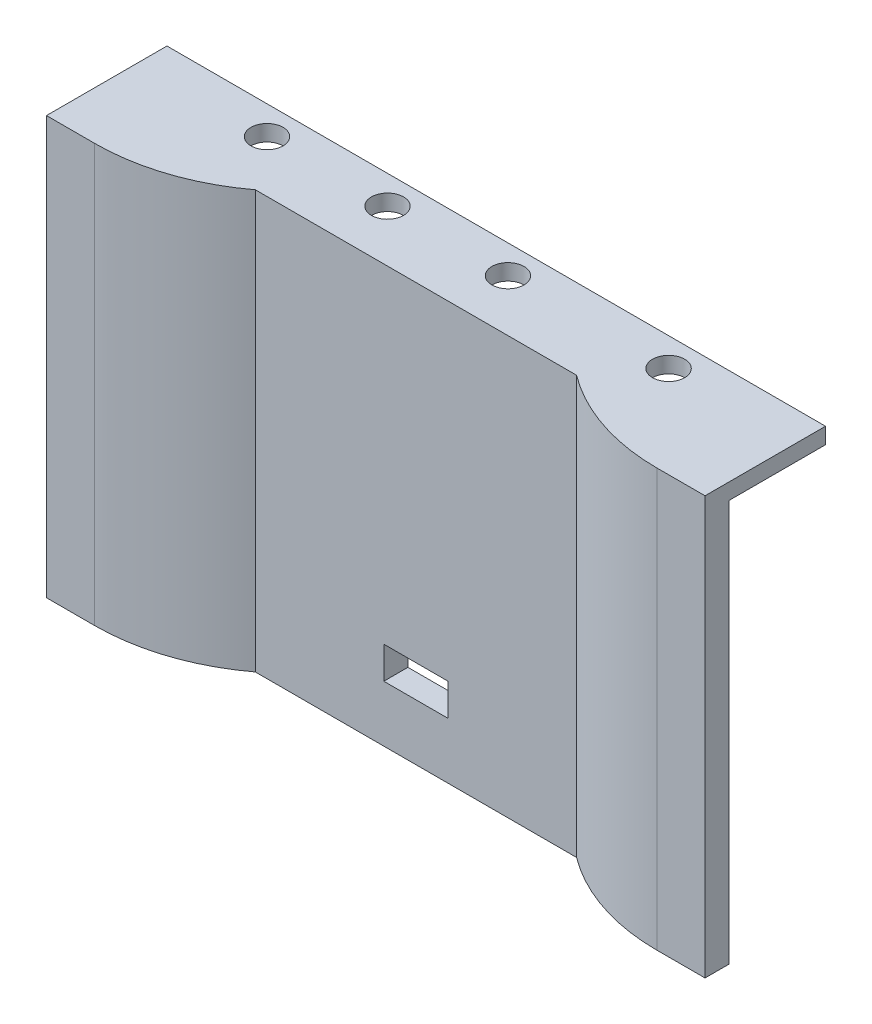
ISO-10303-21;
HEADER;
FILE_DESCRIPTION(('STEP AP214'),'2;1');
FILE_NAME('part.step','',(''),(''),'','','');
FILE_SCHEMA(('AUTOMOTIVE_DESIGN { 1 0 10303 214 1 1 1 1 }'));
ENDSEC;
DATA;
#1=APPLICATION_CONTEXT('core data for automotive mechanical design processes');
#2=APPLICATION_PROTOCOL_DEFINITION('international standard','automotive_design',2000,#1);
#3=PRODUCT_CONTEXT('',#1,'mechanical');
#4=PRODUCT('Part','Part','',(#3));
#5=PRODUCT_RELATED_PRODUCT_CATEGORY('part','',(#4));
#6=PRODUCT_DEFINITION_FORMATION('','',#4);
#7=PRODUCT_DEFINITION_CONTEXT('part definition',#1,'design');
#8=PRODUCT_DEFINITION('design','',#6,#7);
#9=PRODUCT_DEFINITION_SHAPE('','',#8);
#10=(LENGTH_UNIT() NAMED_UNIT(*) SI_UNIT(.MILLI.,.METRE.));
#11=(NAMED_UNIT(*) PLANE_ANGLE_UNIT() SI_UNIT($,.RADIAN.));
#12=(NAMED_UNIT(*) SI_UNIT($,.STERADIAN.) SOLID_ANGLE_UNIT());
#13=UNCERTAINTY_MEASURE_WITH_UNIT(LENGTH_MEASURE(1.E-05),#10,'distance_accuracy_value','');
#14=(GEOMETRIC_REPRESENTATION_CONTEXT(3) GLOBAL_UNCERTAINTY_ASSIGNED_CONTEXT((#13)) GLOBAL_UNIT_ASSIGNED_CONTEXT((#10,
#11,#12)) REPRESENTATION_CONTEXT('',''));
#15=CARTESIAN_POINT('',(0.,0.,0.));
#16=DIRECTION('',(0.,0.,1.));
#17=DIRECTION('',(1.,0.,0.));
#18=AXIS2_PLACEMENT_3D('',#15,#16,#17);
#19=CARTESIAN_POINT('',(41.,52.,7.5));
#20=DIRECTION('',(-1.,0.,0.));
#21=DIRECTION('',(0.,0.,1.));
#22=AXIS2_PLACEMENT_3D('',#19,#20,#21);
#23=PLANE('',#22);
#24=DIRECTION('',(0.,0.,-1.));
#25=VECTOR('',#24,1.);
#26=CARTESIAN_POINT('',(41.,0.,7.5));
#27=LINE('',#26,#25);
#28=CARTESIAN_POINT('',(41.,0.,7.5));
#29=VERTEX_POINT('',#28);
#30=CARTESIAN_POINT('',(41.,0.,4.5));
#31=VERTEX_POINT('',#30);
#32=EDGE_CURVE('E279',#29,#31,#27,.T.);
#33=ORIENTED_EDGE('',*,*,#32,.T.);
#34=DIRECTION('',(0.,1.,0.));
#35=VECTOR('',#34,1.);
#36=CARTESIAN_POINT('',(41.,0.,4.5));
#37=LINE('',#36,#35);
#38=CARTESIAN_POINT('',(41.,50.,4.5));
#39=VERTEX_POINT('',#38);
#40=EDGE_CURVE('E198',#31,#39,#37,.T.);
#41=ORIENTED_EDGE('',*,*,#40,.T.);
#42=DIRECTION('',(0.,0.,-1.));
#43=VECTOR('',#42,1.);
#44=CARTESIAN_POINT('',(41.,50.,4.5));
#45=LINE('',#44,#43);
#46=CARTESIAN_POINT('',(41.,50.,-7.5));
#47=VERTEX_POINT('',#46);
#48=EDGE_CURVE('E192',#39,#47,#45,.T.);
#49=ORIENTED_EDGE('',*,*,#48,.T.);
#50=DIRECTION('',(0.,1.,0.));
#51=VECTOR('',#50,1.);
#52=CARTESIAN_POINT('',(41.,50.,-7.5));
#53=LINE('',#52,#51);
#54=CARTESIAN_POINT('',(41.,52.,-7.5));
#55=VERTEX_POINT('',#54);
#56=EDGE_CURVE('E172',#47,#55,#53,.T.);
#57=ORIENTED_EDGE('',*,*,#56,.T.);
#58=DIRECTION('',(0.,0.,-1.));
#59=VECTOR('',#58,1.);
#60=CARTESIAN_POINT('',(41.,52.,7.5));
#61=LINE('',#60,#59);
#62=CARTESIAN_POINT('',(41.,52.,7.5));
#63=VERTEX_POINT('',#62);
#64=EDGE_CURVE('E282',#63,#55,#61,.T.);
#65=ORIENTED_EDGE('',*,*,#64,.F.);
#66=DIRECTION('',(0.,-1.,0.));
#67=VECTOR('',#66,1.);
#68=CARTESIAN_POINT('',(41.,52.,7.5));
#69=LINE('',#68,#67);
#70=EDGE_CURVE('E300',#63,#29,#69,.T.);
#71=ORIENTED_EDGE('',*,*,#70,.T.);
#72=EDGE_LOOP('',(#33,#41,#49,#57,#65,#71));
#73=FACE_BOUND('',#72,.T.);
#74=ADVANCED_FACE('F43',(#73),#23,.F.);
#75=CARTESIAN_POINT('',(-41.,52.,7.5));
#76=DIRECTION('',(1.,0.,0.));
#77=DIRECTION('',(0.,0.,-1.));
#78=AXIS2_PLACEMENT_3D('',#75,#76,#77);
#79=PLANE('',#78);
#80=DIRECTION('',(0.,0.,1.));
#81=VECTOR('',#80,1.);
#82=CARTESIAN_POINT('',(-41.,52.,7.5));
#83=LINE('',#82,#81);
#84=CARTESIAN_POINT('',(-41.,52.,-7.5));
#85=VERTEX_POINT('',#84);
#86=CARTESIAN_POINT('',(-41.,52.,7.5));
#87=VERTEX_POINT('',#86);
#88=EDGE_CURVE('E285',#85,#87,#83,.T.);
#89=ORIENTED_EDGE('',*,*,#88,.F.);
#90=DIRECTION('',(0.,1.,0.));
#91=VECTOR('',#90,1.);
#92=CARTESIAN_POINT('',(-41.,50.,-7.5));
#93=LINE('',#92,#91);
#94=CARTESIAN_POINT('',(-41.,50.,-7.5));
#95=VERTEX_POINT('',#94);
#96=EDGE_CURVE('E184',#95,#85,#93,.T.);
#97=ORIENTED_EDGE('',*,*,#96,.F.);
#98=DIRECTION('',(0.,0.,1.));
#99=VECTOR('',#98,1.);
#100=CARTESIAN_POINT('',(-41.,50.,4.5));
#101=LINE('',#100,#99);
#102=CARTESIAN_POINT('',(-41.,50.,4.5));
#103=VERTEX_POINT('',#102);
#104=EDGE_CURVE('E194',#95,#103,#101,.T.);
#105=ORIENTED_EDGE('',*,*,#104,.T.);
#106=DIRECTION('',(0.,1.,0.));
#107=VECTOR('',#106,1.);
#108=CARTESIAN_POINT('',(-41.,0.,4.5));
#109=LINE('',#108,#107);
#110=CARTESIAN_POINT('',(-41.,0.,4.5));
#111=VERTEX_POINT('',#110);
#112=EDGE_CURVE('E69',#111,#103,#109,.T.);
#113=ORIENTED_EDGE('',*,*,#112,.F.);
#114=DIRECTION('',(0.,0.,1.));
#115=VECTOR('',#114,1.);
#116=CARTESIAN_POINT('',(-41.,0.,7.5));
#117=LINE('',#116,#115);
#118=CARTESIAN_POINT('',(-41.,0.,7.5));
#119=VERTEX_POINT('',#118);
#120=EDGE_CURVE('E303',#111,#119,#117,.T.);
#121=ORIENTED_EDGE('',*,*,#120,.T.);
#122=DIRECTION('',(0.,-1.,0.));
#123=VECTOR('',#122,1.);
#124=CARTESIAN_POINT('',(-41.,52.,7.5));
#125=LINE('',#124,#123);
#126=EDGE_CURVE('E319',#87,#119,#125,.T.);
#127=ORIENTED_EDGE('',*,*,#126,.F.);
#128=EDGE_LOOP('',(#89,#97,#105,#113,#121,#127));
#129=FACE_BOUND('',#128,.T.);
#130=ADVANCED_FACE('F448',(#129),#79,.F.);
#131=CARTESIAN_POINT('',(-41.,52.,7.5));
#132=DIRECTION('',(0.,0.,-1.));
#133=DIRECTION('',(-1.,0.,0.));
#134=AXIS2_PLACEMENT_3D('',#131,#132,#133);
#135=PLANE('',#134);
#136=DIRECTION('',(1.,0.,0.));
#137=VECTOR('',#136,1.);
#138=CARTESIAN_POINT('',(-41.,0.,7.5));
#139=LINE('',#138,#137);
#140=CARTESIAN_POINT('',(-34.9999999999998,0.,7.49999999999999));
#141=VERTEX_POINT('',#140);
#142=EDGE_CURVE('E306',#119,#141,#139,.T.);
#143=ORIENTED_EDGE('',*,*,#142,.T.);
#144=DIRECTION('',(0.,1.,0.));
#145=VECTOR('',#144,1.);
#146=CARTESIAN_POINT('',(-34.9999999999998,52.,7.5));
#147=LINE('',#146,#145);
#148=CARTESIAN_POINT('',(-34.9999999999998,52.,7.49999999999999));
#149=VERTEX_POINT('',#148);
#150=EDGE_CURVE('E11',#141,#149,#147,.T.);
#151=ORIENTED_EDGE('',*,*,#150,.T.);
#152=DIRECTION('',(1.,0.,0.));
#153=VECTOR('',#152,1.);
#154=CARTESIAN_POINT('',(-41.,52.,7.5));
#155=LINE('',#154,#153);
#156=EDGE_CURVE('E289',#87,#149,#155,.T.);
#157=ORIENTED_EDGE('',*,*,#156,.F.);
#158=ORIENTED_EDGE('',*,*,#126,.T.);
#159=EDGE_LOOP('',(#143,#151,#157,#158));
#160=FACE_BOUND('',#159,.T.);
#161=ADVANCED_FACE('F444',(#160),#135,.F.);
#162=CARTESIAN_POINT('',(-30.,52.,2.5));
#163=DIRECTION('',(0.,0.,-1.));
#164=DIRECTION('',(-1.,0.,0.));
#165=AXIS2_PLACEMENT_3D('',#162,#163,#164);
#166=PLANE('',#165);
#167=DIRECTION('',(-1.,0.,0.));
#168=VECTOR('',#167,1.);
#169=CARTESIAN_POINT('',(-4.,11.,2.5));
#170=LINE('',#169,#168);
#171=CARTESIAN_POINT('',(4.,11.,2.5));
#172=VERTEX_POINT('',#171);
#173=CARTESIAN_POINT('',(-4.,11.,2.5));
#174=VERTEX_POINT('',#173);
#175=EDGE_CURVE('E241',#172,#174,#170,.T.);
#176=ORIENTED_EDGE('',*,*,#175,.F.);
#177=DIRECTION('',(0.,1.,0.));
#178=VECTOR('',#177,1.);
#179=CARTESIAN_POINT('',(4.,6.99999999999999,2.5));
#180=LINE('',#179,#178);
#181=CARTESIAN_POINT('',(4.,6.99999999999999,2.5));
#182=VERTEX_POINT('',#181);
#183=EDGE_CURVE('E226',#182,#172,#180,.T.);
#184=ORIENTED_EDGE('',*,*,#183,.F.);
#185=DIRECTION('',(1.,0.,0.));
#186=VECTOR('',#185,1.);
#187=CARTESIAN_POINT('',(-4.,6.99999999999999,2.5));
#188=LINE('',#187,#186);
#189=CARTESIAN_POINT('',(-4.,6.99999999999999,2.5));
#190=VERTEX_POINT('',#189);
#191=EDGE_CURVE('E249',#190,#182,#188,.T.);
#192=ORIENTED_EDGE('',*,*,#191,.F.);
#193=DIRECTION('',(0.,-1.,0.));
#194=VECTOR('',#193,1.);
#195=CARTESIAN_POINT('',(-4.,6.99999999999999,2.5));
#196=LINE('',#195,#194);
#197=EDGE_CURVE('E245',#174,#190,#196,.T.);
#198=ORIENTED_EDGE('',*,*,#197,.F.);
#199=EDGE_LOOP('',(#176,#184,#192,#198));
#200=FACE_BOUND('',#199,.T.);
#201=DIRECTION('',(1.,0.,0.));
#202=VECTOR('',#201,1.);
#203=CARTESIAN_POINT('',(-30.,0.,2.5));
#204=LINE('',#203,#202);
#205=CARTESIAN_POINT('',(-19.9999999999998,0.,2.5));
#206=VERTEX_POINT('',#205);
#207=CARTESIAN_POINT('',(19.9999999999999,0.,2.5));
#208=VERTEX_POINT('',#207);
#209=EDGE_CURVE('E310',#206,#208,#204,.T.);
#210=ORIENTED_EDGE('',*,*,#209,.T.);
#211=DIRECTION('',(0.,1.,0.));
#212=VECTOR('',#211,1.);
#213=CARTESIAN_POINT('',(19.9999999999999,52.,2.5));
#214=LINE('',#213,#212);
#215=CARTESIAN_POINT('',(19.9999999999999,52.,2.5));
#216=VERTEX_POINT('',#215);
#217=EDGE_CURVE('E326',#208,#216,#214,.T.);
#218=ORIENTED_EDGE('',*,*,#217,.T.);
#219=DIRECTION('',(1.,0.,0.));
#220=VECTOR('',#219,1.);
#221=CARTESIAN_POINT('',(-30.,52.,2.5));
#222=LINE('',#221,#220);
#223=CARTESIAN_POINT('',(-19.9999999999998,52.,2.5));
#224=VERTEX_POINT('',#223);
#225=EDGE_CURVE('E293',#224,#216,#222,.T.);
#226=ORIENTED_EDGE('',*,*,#225,.F.);
#227=DIRECTION('',(0.,-1.,0.));
#228=VECTOR('',#227,1.);
#229=CARTESIAN_POINT('',(-19.9999999999998,0.,2.5));
#230=LINE('',#229,#228);
#231=EDGE_CURVE('E323',#224,#206,#230,.T.);
#232=ORIENTED_EDGE('',*,*,#231,.T.);
#233=EDGE_LOOP('',(#210,#218,#226,#232));
#234=FACE_BOUND('',#233,.T.);
#235=ADVANCED_FACE('F432',(#200,#234),#166,.F.);
#236=CARTESIAN_POINT('',(30.,52.,7.5));
#237=DIRECTION('',(0.,0.,-1.));
#238=DIRECTION('',(-1.,0.,0.));
#239=AXIS2_PLACEMENT_3D('',#236,#237,#238);
#240=PLANE('',#239);
#241=DIRECTION('',(1.,0.,0.));
#242=VECTOR('',#241,1.);
#243=CARTESIAN_POINT('',(30.,52.,7.5));
#244=LINE('',#243,#242);
#245=CARTESIAN_POINT('',(35.,52.,7.5));
#246=VERTEX_POINT('',#245);
#247=EDGE_CURVE('E297',#246,#63,#244,.T.);
#248=ORIENTED_EDGE('',*,*,#247,.F.);
#249=DIRECTION('',(0.,-1.,0.));
#250=VECTOR('',#249,1.);
#251=CARTESIAN_POINT('',(35.,52.,7.5));
#252=LINE('',#251,#250);
#253=CARTESIAN_POINT('',(35.,0.,7.5));
#254=VERTEX_POINT('',#253);
#255=EDGE_CURVE('E345',#246,#254,#252,.T.);
#256=ORIENTED_EDGE('',*,*,#255,.T.);
#257=DIRECTION('',(1.,0.,0.));
#258=VECTOR('',#257,1.);
#259=CARTESIAN_POINT('',(30.,0.,7.5));
#260=LINE('',#259,#258);
#261=EDGE_CURVE('E286',#254,#29,#260,.T.);
#262=ORIENTED_EDGE('',*,*,#261,.T.);
#263=ORIENTED_EDGE('',*,*,#70,.F.);
#264=EDGE_LOOP('',(#248,#256,#262,#263));
#265=FACE_BOUND('',#264,.T.);
#266=ADVANCED_FACE('F425',(#265),#240,.F.);
#267=CARTESIAN_POINT('',(0.,52.,0.));
#268=DIRECTION('',(0.,-1.,0.));
#269=DIRECTION('',(0.,0.,-1.));
#270=AXIS2_PLACEMENT_3D('',#267,#268,#269);
#271=PLANE('',#270);
#272=CARTESIAN_POINT('',(-25.,52.,-3.96));
#273=DIRECTION('',(0.,1.,0.));
#274=DIRECTION('',(0.,0.,1.));
#275=AXIS2_PLACEMENT_3D('',#272,#273,#274);
#276=CIRCLE('',#275,2.);
#277=CARTESIAN_POINT('',(-25.,52.,-1.96));
#278=VERTEX_POINT('',#277);
#279=EDGE_CURVE('E365',#278,#278,#276,.T.);
#280=ORIENTED_EDGE('',*,*,#279,.F.);
#281=EDGE_LOOP('',(#280));
#282=FACE_BOUND('',#281,.T.);
#283=CARTESIAN_POINT('',(-10.,52.,-3.96));
#284=DIRECTION('',(0.,1.,0.));
#285=DIRECTION('',(0.,0.,1.));
#286=AXIS2_PLACEMENT_3D('',#283,#284,#285);
#287=CIRCLE('',#286,2.);
#288=CARTESIAN_POINT('',(-10.,52.,-1.96));
#289=VERTEX_POINT('',#288);
#290=EDGE_CURVE('E402',#289,#289,#287,.T.);
#291=ORIENTED_EDGE('',*,*,#290,.F.);
#292=EDGE_LOOP('',(#291));
#293=FACE_BOUND('',#292,.T.);
#294=CARTESIAN_POINT('',(5.,52.,-3.96));
#295=DIRECTION('',(0.,1.,0.));
#296=DIRECTION('',(0.,0.,1.));
#297=AXIS2_PLACEMENT_3D('',#294,#295,#296);
#298=CIRCLE('',#297,2.);
#299=CARTESIAN_POINT('',(5.,52.,-1.96));
#300=VERTEX_POINT('',#299);
#301=EDGE_CURVE('E398',#300,#300,#298,.T.);
#302=ORIENTED_EDGE('',*,*,#301,.F.);
#303=EDGE_LOOP('',(#302));
#304=FACE_BOUND('',#303,.T.);
#305=CARTESIAN_POINT('',(25.,52.,-3.96));
#306=DIRECTION('',(0.,1.,0.));
#307=DIRECTION('',(0.,0.,1.));
#308=AXIS2_PLACEMENT_3D('',#305,#306,#307);
#309=CIRCLE('',#308,2.);
#310=CARTESIAN_POINT('',(25.,52.,-1.96));
#311=VERTEX_POINT('',#310);
#312=EDGE_CURVE('E395',#311,#311,#309,.T.);
#313=ORIENTED_EDGE('',*,*,#312,.F.);
#314=EDGE_LOOP('',(#313));
#315=FACE_BOUND('',#314,.T.);
#316=ORIENTED_EDGE('',*,*,#64,.T.);
#317=DIRECTION('',(-1.,0.,0.));
#318=VECTOR('',#317,1.);
#319=CARTESIAN_POINT('',(-41.,52.,-7.5));
#320=LINE('',#319,#318);
#321=EDGE_CURVE('E179',#55,#85,#320,.T.);
#322=ORIENTED_EDGE('',*,*,#321,.T.);
#323=ORIENTED_EDGE('',*,*,#88,.T.);
#324=ORIENTED_EDGE('',*,*,#156,.T.);
#325=CARTESIAN_POINT('',(-34.9999999999998,52.,-17.5));
#326=DIRECTION('',(0.,-1.,0.));
#327=DIRECTION('',(0.,0.,-1.));
#328=AXIS2_PLACEMENT_3D('',#325,#326,#327);
#329=CIRCLE('',#328,25.);
#330=EDGE_CURVE('E355',#149,#224,#329,.F.);
#331=ORIENTED_EDGE('',*,*,#330,.T.);
#332=ORIENTED_EDGE('',*,*,#225,.T.);
#333=CARTESIAN_POINT('',(35.,52.,-17.5));
#334=DIRECTION('',(0.,-1.,0.));
#335=DIRECTION('',(0.,0.,-1.));
#336=AXIS2_PLACEMENT_3D('',#333,#334,#335);
#337=CIRCLE('',#336,25.);
#338=EDGE_CURVE('E53',#216,#246,#337,.F.);
#339=ORIENTED_EDGE('',*,*,#338,.T.);
#340=ORIENTED_EDGE('',*,*,#247,.T.);
#341=EDGE_LOOP('',(#316,#322,#323,#324,#331,#332,#339,#340));
#342=FACE_BOUND('',#341,.T.);
#343=ADVANCED_FACE('F438',(#282,#293,#304,#315,#342),#271,.F.);
#344=CARTESIAN_POINT('',(0.,0.,0.));
#345=DIRECTION('',(0.,-1.,0.));
#346=DIRECTION('',(0.,0.,-1.));
#347=AXIS2_PLACEMENT_3D('',#344,#345,#346);
#348=PLANE('',#347);
#349=DIRECTION('',(0.,0.,-1.));
#350=VECTOR('',#349,1.);
#351=CARTESIAN_POINT('',(-30.,0.,-0.499999999999999));
#352=LINE('',#351,#350);
#353=CARTESIAN_POINT('',(-30.,0.,4.5));
#354=VERTEX_POINT('',#353);
#355=CARTESIAN_POINT('',(-30.,0.,-0.499999999999999));
#356=VERTEX_POINT('',#355);
#357=EDGE_CURVE('E216',#354,#356,#352,.T.);
#358=ORIENTED_EDGE('',*,*,#357,.T.);
#359=DIRECTION('',(1.,0.,0.));
#360=VECTOR('',#359,1.);
#361=CARTESIAN_POINT('',(-33.,0.,-0.499999999999999));
#362=LINE('',#361,#360);
#363=CARTESIAN_POINT('',(30.,0.,-0.499999999999999));
#364=VERTEX_POINT('',#363);
#365=EDGE_CURVE('E269',#356,#364,#362,.T.);
#366=ORIENTED_EDGE('',*,*,#365,.T.);
#367=DIRECTION('',(0.,0.,1.));
#368=VECTOR('',#367,1.);
#369=CARTESIAN_POINT('',(30.,0.,-0.499999999999999));
#370=LINE('',#369,#368);
#371=CARTESIAN_POINT('',(30.,0.,4.5));
#372=VERTEX_POINT('',#371);
#373=EDGE_CURVE('E214',#364,#372,#370,.T.);
#374=ORIENTED_EDGE('',*,*,#373,.T.);
#375=DIRECTION('',(1.,0.,0.));
#376=VECTOR('',#375,1.);
#377=CARTESIAN_POINT('',(41.,0.,4.5));
#378=LINE('',#377,#376);
#379=EDGE_CURVE('E273',#372,#31,#378,.T.);
#380=ORIENTED_EDGE('',*,*,#379,.T.);
#381=ORIENTED_EDGE('',*,*,#32,.F.);
#382=ORIENTED_EDGE('',*,*,#261,.F.);
#383=CARTESIAN_POINT('',(35.,0.,-17.5));
#384=DIRECTION('',(0.,-1.,0.));
#385=DIRECTION('',(0.,0.,-1.));
#386=AXIS2_PLACEMENT_3D('',#383,#384,#385);
#387=CIRCLE('',#386,25.);
#388=EDGE_CURVE('E352',#254,#208,#387,.T.);
#389=ORIENTED_EDGE('',*,*,#388,.T.);
#390=ORIENTED_EDGE('',*,*,#209,.F.);
#391=CARTESIAN_POINT('',(-34.9999999999998,0.,-17.5));
#392=DIRECTION('',(0.,-1.,0.));
#393=DIRECTION('',(0.,0.,-1.));
#394=AXIS2_PLACEMENT_3D('',#391,#392,#393);
#395=CIRCLE('',#394,25.);
#396=EDGE_CURVE('E349',#206,#141,#395,.T.);
#397=ORIENTED_EDGE('',*,*,#396,.T.);
#398=ORIENTED_EDGE('',*,*,#142,.F.);
#399=ORIENTED_EDGE('',*,*,#120,.F.);
#400=DIRECTION('',(1.,0.,0.));
#401=VECTOR('',#400,1.);
#402=CARTESIAN_POINT('',(-41.,0.,4.5));
#403=LINE('',#402,#401);
#404=EDGE_CURVE('E257',#111,#354,#403,.T.);
#405=ORIENTED_EDGE('',*,*,#404,.T.);
#406=EDGE_LOOP('',(#358,#366,#374,#380,#381,#382,#389,#390,#397,#398,#399,#405));
#407=FACE_BOUND('',#406,.T.);
#408=ADVANCED_FACE('F420',(#407),#348,.T.);
#409=CARTESIAN_POINT('',(41.,0.,4.5));
#410=DIRECTION('',(0.,0.,1.));
#411=DIRECTION('',(1.,0.,0.));
#412=AXIS2_PLACEMENT_3D('',#409,#410,#411);
#413=PLANE('',#412);
#414=DIRECTION('',(0.,1.,0.));
#415=VECTOR('',#414,1.);
#416=CARTESIAN_POINT('',(30.,0.,4.5));
#417=LINE('',#416,#415);
#418=CARTESIAN_POINT('',(30.,50.,4.5));
#419=VERTEX_POINT('',#418);
#420=EDGE_CURVE('E221',#372,#419,#417,.T.);
#421=ORIENTED_EDGE('',*,*,#420,.T.);
#422=DIRECTION('',(1.,0.,0.));
#423=VECTOR('',#422,1.);
#424=CARTESIAN_POINT('',(41.,50.,4.5));
#425=LINE('',#424,#423);
#426=EDGE_CURVE('E61',#419,#39,#425,.T.);
#427=ORIENTED_EDGE('',*,*,#426,.T.);
#428=ORIENTED_EDGE('',*,*,#40,.F.);
#429=ORIENTED_EDGE('',*,*,#379,.F.);
#430=EDGE_LOOP('',(#421,#427,#428,#429));
#431=FACE_BOUND('',#430,.T.);
#432=ADVANCED_FACE('F417',(#431),#413,.F.);
#433=CARTESIAN_POINT('',(-33.,0.,-0.499999999999999));
#434=DIRECTION('',(0.,0.,1.));
#435=DIRECTION('',(1.,0.,0.));
#436=AXIS2_PLACEMENT_3D('',#433,#434,#435);
#437=PLANE('',#436);
#438=DIRECTION('',(1.,0.,0.));
#439=VECTOR('',#438,1.);
#440=CARTESIAN_POINT('',(-33.,6.99999999999999,-0.499999999999999));
#441=LINE('',#440,#439);
#442=CARTESIAN_POINT('',(-4.,6.99999999999999,-0.500000000000014));
#443=VERTEX_POINT('',#442);
#444=CARTESIAN_POINT('',(4.,6.99999999999999,-0.500000000000014));
#445=VERTEX_POINT('',#444);
#446=EDGE_CURVE('E337',#443,#445,#441,.T.);
#447=ORIENTED_EDGE('',*,*,#446,.T.);
#448=DIRECTION('',(0.,1.,0.));
#449=VECTOR('',#448,1.);
#450=CARTESIAN_POINT('',(4.,0.,-0.499999999999999));
#451=LINE('',#450,#449);
#452=CARTESIAN_POINT('',(4.,11.,-0.500000000000014));
#453=VERTEX_POINT('',#452);
#454=EDGE_CURVE('E341',#445,#453,#451,.T.);
#455=ORIENTED_EDGE('',*,*,#454,.T.);
#456=DIRECTION('',(-1.,0.,0.));
#457=VECTOR('',#456,1.);
#458=CARTESIAN_POINT('',(-33.,11.,-0.499999999999999));
#459=LINE('',#458,#457);
#460=CARTESIAN_POINT('',(-4.,11.,-0.499999999999999));
#461=VERTEX_POINT('',#460);
#462=EDGE_CURVE('E329',#453,#461,#459,.T.);
#463=ORIENTED_EDGE('',*,*,#462,.T.);
#464=DIRECTION('',(0.,-1.,0.));
#465=VECTOR('',#464,1.);
#466=CARTESIAN_POINT('',(-4.,0.,-0.499999999999999));
#467=LINE('',#466,#465);
#468=EDGE_CURVE('E333',#461,#443,#467,.T.);
#469=ORIENTED_EDGE('',*,*,#468,.T.);
#470=EDGE_LOOP('',(#447,#455,#463,#469));
#471=FACE_BOUND('',#470,.T.);
#472=DIRECTION('',(0.,1.,0.));
#473=VECTOR('',#472,1.);
#474=CARTESIAN_POINT('',(-30.,0.,-0.499999999999999));
#475=LINE('',#474,#473);
#476=CARTESIAN_POINT('',(-30.,50.,-0.499999999999999));
#477=VERTEX_POINT('',#476);
#478=EDGE_CURVE('E222',#356,#477,#475,.T.);
#479=ORIENTED_EDGE('',*,*,#478,.T.);
#480=DIRECTION('',(1.,0.,0.));
#481=VECTOR('',#480,1.);
#482=CARTESIAN_POINT('',(-30.,50.,-0.499999999999999));
#483=LINE('',#482,#481);
#484=CARTESIAN_POINT('',(30.,50.,-0.499999999999999));
#485=VERTEX_POINT('',#484);
#486=EDGE_CURVE('E408',#477,#485,#483,.T.);
#487=ORIENTED_EDGE('',*,*,#486,.T.);
#488=DIRECTION('',(0.,1.,0.));
#489=VECTOR('',#488,1.);
#490=CARTESIAN_POINT('',(30.,0.,-0.499999999999999));
#491=LINE('',#490,#489);
#492=EDGE_CURVE('E233',#364,#485,#491,.T.);
#493=ORIENTED_EDGE('',*,*,#492,.F.);
#494=ORIENTED_EDGE('',*,*,#365,.F.);
#495=EDGE_LOOP('',(#479,#487,#493,#494));
#496=FACE_BOUND('',#495,.T.);
#497=ADVANCED_FACE('F456',(#471,#496),#437,.F.);
#498=CARTESIAN_POINT('',(-41.,0.,4.5));
#499=DIRECTION('',(0.,0.,1.));
#500=DIRECTION('',(1.,0.,0.));
#501=AXIS2_PLACEMENT_3D('',#498,#499,#500);
#502=PLANE('',#501);
#503=ORIENTED_EDGE('',*,*,#112,.T.);
#504=DIRECTION('',(1.,0.,0.));
#505=VECTOR('',#504,1.);
#506=CARTESIAN_POINT('',(-41.,50.,4.5));
#507=LINE('',#506,#505);
#508=CARTESIAN_POINT('',(-30.,50.,4.5));
#509=VERTEX_POINT('',#508);
#510=EDGE_CURVE('E185',#103,#509,#507,.T.);
#511=ORIENTED_EDGE('',*,*,#510,.T.);
#512=DIRECTION('',(0.,1.,0.));
#513=VECTOR('',#512,1.);
#514=CARTESIAN_POINT('',(-30.,0.,4.5));
#515=LINE('',#514,#513);
#516=EDGE_CURVE('E220',#354,#509,#515,.T.);
#517=ORIENTED_EDGE('',*,*,#516,.F.);
#518=ORIENTED_EDGE('',*,*,#404,.F.);
#519=EDGE_LOOP('',(#503,#511,#517,#518));
#520=FACE_BOUND('',#519,.T.);
#521=ADVANCED_FACE('F452',(#520),#502,.F.);
#522=CARTESIAN_POINT('',(4.,6.99999999999999,-49.5));
#523=DIRECTION('',(1.,0.,0.));
#524=DIRECTION('',(0.,0.,-1.));
#525=AXIS2_PLACEMENT_3D('',#522,#523,#524);
#526=PLANE('',#525);
#527=DIRECTION('',(0.,0.,1.));
#528=VECTOR('',#527,1.);
#529=CARTESIAN_POINT('',(4.,6.99999999999999,-49.5));
#530=LINE('',#529,#528);
#531=EDGE_CURVE('E254',#445,#182,#530,.T.);
#532=ORIENTED_EDGE('',*,*,#531,.T.);
#533=ORIENTED_EDGE('',*,*,#183,.T.);
#534=DIRECTION('',(0.,0.,1.));
#535=VECTOR('',#534,1.);
#536=CARTESIAN_POINT('',(4.,11.,-49.5));
#537=LINE('',#536,#535);
#538=EDGE_CURVE('E253',#453,#172,#537,.T.);
#539=ORIENTED_EDGE('',*,*,#538,.F.);
#540=ORIENTED_EDGE('',*,*,#454,.F.);
#541=EDGE_LOOP('',(#532,#533,#539,#540));
#542=FACE_BOUND('',#541,.T.);
#543=ADVANCED_FACE('F464',(#542),#526,.F.);
#544=CARTESIAN_POINT('',(-4.,6.99999999999999,-49.5));
#545=DIRECTION('',(0.,-1.,0.));
#546=DIRECTION('',(0.,0.,-1.));
#547=AXIS2_PLACEMENT_3D('',#544,#545,#546);
#548=PLANE('',#547);
#549=DIRECTION('',(0.,0.,1.));
#550=VECTOR('',#549,1.);
#551=CARTESIAN_POINT('',(-4.,6.99999999999999,-49.5));
#552=LINE('',#551,#550);
#553=EDGE_CURVE('E258',#443,#190,#552,.T.);
#554=ORIENTED_EDGE('',*,*,#553,.T.);
#555=ORIENTED_EDGE('',*,*,#191,.T.);
#556=ORIENTED_EDGE('',*,*,#531,.F.);
#557=ORIENTED_EDGE('',*,*,#446,.F.);
#558=EDGE_LOOP('',(#554,#555,#556,#557));
#559=FACE_BOUND('',#558,.T.);
#560=ADVANCED_FACE('F486',(#559),#548,.F.);
#561=CARTESIAN_POINT('',(-4.,6.99999999999999,-49.5));
#562=DIRECTION('',(-1.,0.,0.));
#563=DIRECTION('',(0.,0.,1.));
#564=AXIS2_PLACEMENT_3D('',#561,#562,#563);
#565=PLANE('',#564);
#566=DIRECTION('',(0.,0.,1.));
#567=VECTOR('',#566,1.);
#568=CARTESIAN_POINT('',(-4.,11.,-49.5));
#569=LINE('',#568,#567);
#570=EDGE_CURVE('E261',#461,#174,#569,.T.);
#571=ORIENTED_EDGE('',*,*,#570,.T.);
#572=ORIENTED_EDGE('',*,*,#197,.T.);
#573=ORIENTED_EDGE('',*,*,#553,.F.);
#574=ORIENTED_EDGE('',*,*,#468,.F.);
#575=EDGE_LOOP('',(#571,#572,#573,#574));
#576=FACE_BOUND('',#575,.T.);
#577=ADVANCED_FACE('F480',(#576),#565,.F.);
#578=CARTESIAN_POINT('',(-4.,11.,-49.5));
#579=DIRECTION('',(0.,1.,0.));
#580=DIRECTION('',(0.,0.,1.));
#581=AXIS2_PLACEMENT_3D('',#578,#579,#580);
#582=PLANE('',#581);
#583=ORIENTED_EDGE('',*,*,#538,.T.);
#584=ORIENTED_EDGE('',*,*,#175,.T.);
#585=ORIENTED_EDGE('',*,*,#570,.F.);
#586=ORIENTED_EDGE('',*,*,#462,.F.);
#587=EDGE_LOOP('',(#583,#584,#585,#586));
#588=FACE_BOUND('',#587,.T.);
#589=ADVANCED_FACE('F475',(#588),#582,.F.);
#590=CARTESIAN_POINT('',(35.,52.,-17.5));
#591=DIRECTION('',(0.,-1.,0.));
#592=DIRECTION('',(0.,0.,-1.));
#593=AXIS2_PLACEMENT_3D('',#590,#591,#592);
#594=CYLINDRICAL_SURFACE('',#593,25.);
#595=ORIENTED_EDGE('',*,*,#338,.F.);
#596=ORIENTED_EDGE('',*,*,#217,.F.);
#597=ORIENTED_EDGE('',*,*,#388,.F.);
#598=ORIENTED_EDGE('',*,*,#255,.F.);
#599=EDGE_LOOP('',(#595,#596,#597,#598));
#600=FACE_BOUND('',#599,.T.);
#601=ADVANCED_FACE('F436',(#600),#594,.T.);
#602=CARTESIAN_POINT('',(-34.9999999999998,52.,-17.5));
#603=DIRECTION('',(0.,1.,0.));
#604=DIRECTION('',(0.,0.,1.));
#605=AXIS2_PLACEMENT_3D('',#602,#603,#604);
#606=CYLINDRICAL_SURFACE('',#605,25.);
#607=ORIENTED_EDGE('',*,*,#396,.F.);
#608=ORIENTED_EDGE('',*,*,#231,.F.);
#609=ORIENTED_EDGE('',*,*,#330,.F.);
#610=ORIENTED_EDGE('',*,*,#150,.F.);
#611=EDGE_LOOP('',(#607,#608,#609,#610));
#612=FACE_BOUND('',#611,.T.);
#613=ADVANCED_FACE('F45',(#612),#606,.T.);
#614=CARTESIAN_POINT('',(-30.,0.,-0.499999999999999));
#615=DIRECTION('',(1.,0.,0.));
#616=DIRECTION('',(0.,0.,-1.));
#617=AXIS2_PLACEMENT_3D('',#614,#615,#616);
#618=PLANE('',#617);
#619=ORIENTED_EDGE('',*,*,#516,.T.);
#620=DIRECTION('',(0.,0.,-1.));
#621=VECTOR('',#620,1.);
#622=CARTESIAN_POINT('',(-30.,50.,4.5));
#623=LINE('',#622,#621);
#624=EDGE_CURVE('E212',#509,#477,#623,.T.);
#625=ORIENTED_EDGE('',*,*,#624,.T.);
#626=ORIENTED_EDGE('',*,*,#478,.F.);
#627=ORIENTED_EDGE('',*,*,#357,.F.);
#628=EDGE_LOOP('',(#619,#625,#626,#627));
#629=FACE_BOUND('',#628,.T.);
#630=ADVANCED_FACE('F454',(#629),#618,.F.);
#631=CARTESIAN_POINT('',(30.,0.,-0.499999999999999));
#632=DIRECTION('',(-1.,0.,0.));
#633=DIRECTION('',(0.,0.,1.));
#634=AXIS2_PLACEMENT_3D('',#631,#632,#633);
#635=PLANE('',#634);
#636=ORIENTED_EDGE('',*,*,#492,.T.);
#637=DIRECTION('',(0.,0.,1.));
#638=VECTOR('',#637,1.);
#639=CARTESIAN_POINT('',(30.,50.,4.5));
#640=LINE('',#639,#638);
#641=EDGE_CURVE('E202',#485,#419,#640,.T.);
#642=ORIENTED_EDGE('',*,*,#641,.T.);
#643=ORIENTED_EDGE('',*,*,#420,.F.);
#644=ORIENTED_EDGE('',*,*,#373,.F.);
#645=EDGE_LOOP('',(#636,#642,#643,#644));
#646=FACE_BOUND('',#645,.T.);
#647=ADVANCED_FACE('F414',(#646),#635,.F.);
#648=CARTESIAN_POINT('',(-41.,50.,-7.5));
#649=DIRECTION('',(0.,0.,-1.));
#650=DIRECTION('',(-1.,0.,0.));
#651=AXIS2_PLACEMENT_3D('',#648,#649,#650);
#652=PLANE('',#651);
#653=ORIENTED_EDGE('',*,*,#321,.F.);
#654=ORIENTED_EDGE('',*,*,#56,.F.);
#655=DIRECTION('',(-1.,0.,0.));
#656=VECTOR('',#655,1.);
#657=CARTESIAN_POINT('',(41.,50.,-7.5));
#658=LINE('',#657,#656);
#659=EDGE_CURVE('E176',#47,#95,#658,.T.);
#660=ORIENTED_EDGE('',*,*,#659,.T.);
#661=ORIENTED_EDGE('',*,*,#96,.T.);
#662=EDGE_LOOP('',(#653,#654,#660,#661));
#663=FACE_BOUND('',#662,.T.);
#664=ADVANCED_FACE('F174',(#663),#652,.T.);
#665=CARTESIAN_POINT('',(0.,50.,0.));
#666=DIRECTION('',(0.,-1.,0.));
#667=DIRECTION('',(0.,0.,-1.));
#668=AXIS2_PLACEMENT_3D('',#665,#666,#667);
#669=PLANE('',#668);
#670=CARTESIAN_POINT('',(-25.,50.,-3.96));
#671=DIRECTION('',(0.,-1.,0.));
#672=DIRECTION('',(0.,0.,-1.));
#673=AXIS2_PLACEMENT_3D('',#670,#671,#672);
#674=CIRCLE('',#673,2.);
#675=CARTESIAN_POINT('',(-25.,50.,-5.96));
#676=VERTEX_POINT('',#675);
#677=EDGE_CURVE('E47',#676,#676,#674,.T.);
#678=ORIENTED_EDGE('',*,*,#677,.F.);
#679=EDGE_LOOP('',(#678));
#680=FACE_BOUND('',#679,.T.);
#681=CARTESIAN_POINT('',(-10.,50.,-3.96));
#682=DIRECTION('',(0.,-1.,0.));
#683=DIRECTION('',(0.,0.,-1.));
#684=AXIS2_PLACEMENT_3D('',#681,#682,#683);
#685=CIRCLE('',#684,2.);
#686=CARTESIAN_POINT('',(-10.,50.,-5.96));
#687=VERTEX_POINT('',#686);
#688=EDGE_CURVE('E368',#687,#687,#685,.T.);
#689=ORIENTED_EDGE('',*,*,#688,.F.);
#690=EDGE_LOOP('',(#689));
#691=FACE_BOUND('',#690,.T.);
#692=CARTESIAN_POINT('',(5.,50.,-3.96));
#693=DIRECTION('',(0.,-1.,0.));
#694=DIRECTION('',(0.,0.,-1.));
#695=AXIS2_PLACEMENT_3D('',#692,#693,#694);
#696=CIRCLE('',#695,2.);
#697=CARTESIAN_POINT('',(5.,50.,-5.96));
#698=VERTEX_POINT('',#697);
#699=EDGE_CURVE('E364',#698,#698,#696,.T.);
#700=ORIENTED_EDGE('',*,*,#699,.F.);
#701=EDGE_LOOP('',(#700));
#702=FACE_BOUND('',#701,.T.);
#703=CARTESIAN_POINT('',(25.,50.,-3.96));
#704=DIRECTION('',(0.,-1.,0.));
#705=DIRECTION('',(0.,0.,-1.));
#706=AXIS2_PLACEMENT_3D('',#703,#704,#705);
#707=CIRCLE('',#706,2.);
#708=CARTESIAN_POINT('',(25.,50.,-5.96));
#709=VERTEX_POINT('',#708);
#710=EDGE_CURVE('E360',#709,#709,#707,.T.);
#711=ORIENTED_EDGE('',*,*,#710,.F.);
#712=EDGE_LOOP('',(#711));
#713=FACE_BOUND('',#712,.T.);
#714=ORIENTED_EDGE('',*,*,#624,.F.);
#715=ORIENTED_EDGE('',*,*,#510,.F.);
#716=ORIENTED_EDGE('',*,*,#104,.F.);
#717=ORIENTED_EDGE('',*,*,#659,.F.);
#718=ORIENTED_EDGE('',*,*,#48,.F.);
#719=ORIENTED_EDGE('',*,*,#426,.F.);
#720=ORIENTED_EDGE('',*,*,#641,.F.);
#721=ORIENTED_EDGE('',*,*,#486,.F.);
#722=EDGE_LOOP('',(#714,#715,#716,#717,#718,#719,#720,#721));
#723=FACE_BOUND('',#722,.T.);
#724=ADVANCED_FACE('F191',(#680,#691,#702,#713,#723),#669,.T.);
#725=CARTESIAN_POINT('',(25.,31.,-3.96));
#726=DIRECTION('',(0.,1.,0.));
#727=DIRECTION('',(0.,0.,1.));
#728=AXIS2_PLACEMENT_3D('',#725,#726,#727);
#729=CYLINDRICAL_SURFACE('',#728,2.);
#730=ORIENTED_EDGE('',*,*,#710,.T.);
#731=EDGE_LOOP('',(#730));
#732=FACE_BOUND('',#731,.T.);
#733=ORIENTED_EDGE('',*,*,#312,.T.);
#734=EDGE_LOOP('',(#733));
#735=FACE_BOUND('',#734,.T.);
#736=ADVANCED_FACE('F382',(#732,#735),#729,.F.);
#737=CARTESIAN_POINT('',(5.,31.,-3.96));
#738=DIRECTION('',(0.,1.,0.));
#739=DIRECTION('',(0.,0.,1.));
#740=AXIS2_PLACEMENT_3D('',#737,#738,#739);
#741=CYLINDRICAL_SURFACE('',#740,2.);
#742=ORIENTED_EDGE('',*,*,#699,.T.);
#743=EDGE_LOOP('',(#742));
#744=FACE_BOUND('',#743,.T.);
#745=ORIENTED_EDGE('',*,*,#301,.T.);
#746=EDGE_LOOP('',(#745));
#747=FACE_BOUND('',#746,.T.);
#748=ADVANCED_FACE('F391',(#744,#747),#741,.F.);
#749=CARTESIAN_POINT('',(-10.,31.,-3.96));
#750=DIRECTION('',(0.,1.,0.));
#751=DIRECTION('',(0.,0.,1.));
#752=AXIS2_PLACEMENT_3D('',#749,#750,#751);
#753=CYLINDRICAL_SURFACE('',#752,2.);
#754=ORIENTED_EDGE('',*,*,#688,.T.);
#755=EDGE_LOOP('',(#754));
#756=FACE_BOUND('',#755,.T.);
#757=ORIENTED_EDGE('',*,*,#290,.T.);
#758=EDGE_LOOP('',(#757));
#759=FACE_BOUND('',#758,.T.);
#760=ADVANCED_FACE('F529',(#756,#759),#753,.F.);
#761=CARTESIAN_POINT('',(-25.,31.,-3.96));
#762=DIRECTION('',(0.,1.,0.));
#763=DIRECTION('',(0.,0.,1.));
#764=AXIS2_PLACEMENT_3D('',#761,#762,#763);
#765=CYLINDRICAL_SURFACE('',#764,2.);
#766=ORIENTED_EDGE('',*,*,#677,.T.);
#767=EDGE_LOOP('',(#766));
#768=FACE_BOUND('',#767,.T.);
#769=ORIENTED_EDGE('',*,*,#279,.T.);
#770=EDGE_LOOP('',(#769));
#771=FACE_BOUND('',#770,.T.);
#772=ADVANCED_FACE('F377',(#768,#771),#765,.F.);
#773=CLOSED_SHELL('',(#74,#130,#161,#235,#266,#343,#408,#432,#497,#521,#543,#560,#577,#589,#601,
#613,#630,#647,#664,#724,#736,#748,#760,#772));
#774=MANIFOLD_SOLID_BREP('B2',#773);
#775=ADVANCED_BREP_SHAPE_REPRESENTATION('',(#18,#774),#14);
#776=SHAPE_DEFINITION_REPRESENTATION(#9,#775);
ENDSEC;
END-ISO-10303-21;
